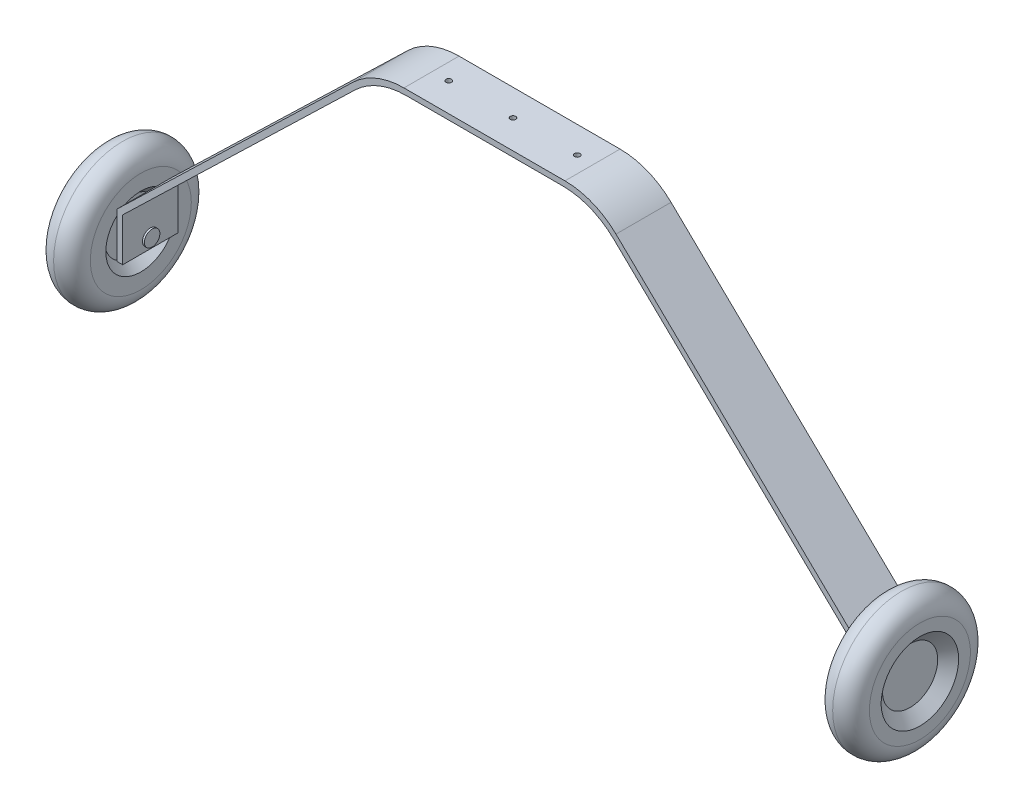
ISO-10303-21;
HEADER;
FILE_DESCRIPTION(('STEP AP214'),'2;1');
FILE_NAME('part.step','',(''),(''),'','','');
FILE_SCHEMA(('AUTOMOTIVE_DESIGN { 1 0 10303 214 1 1 1 1 }'));
ENDSEC;
DATA;
#1=APPLICATION_CONTEXT('core data for automotive mechanical design processes');
#2=APPLICATION_PROTOCOL_DEFINITION('international standard','automotive_design',2000,#1);
#3=PRODUCT_CONTEXT('',#1,'mechanical');
#4=PRODUCT('Part','Part','',(#3));
#5=PRODUCT_RELATED_PRODUCT_CATEGORY('part','',(#4));
#6=PRODUCT_DEFINITION_FORMATION('','',#4);
#7=PRODUCT_DEFINITION_CONTEXT('part definition',#1,'design');
#8=PRODUCT_DEFINITION('design','',#6,#7);
#9=PRODUCT_DEFINITION_SHAPE('','',#8);
#10=(LENGTH_UNIT() NAMED_UNIT(*) SI_UNIT(.MILLI.,.METRE.));
#11=(NAMED_UNIT(*) PLANE_ANGLE_UNIT() SI_UNIT($,.RADIAN.));
#12=(NAMED_UNIT(*) SI_UNIT($,.STERADIAN.) SOLID_ANGLE_UNIT());
#13=UNCERTAINTY_MEASURE_WITH_UNIT(LENGTH_MEASURE(1.E-05),#10,'distance_accuracy_value','');
#14=(GEOMETRIC_REPRESENTATION_CONTEXT(3) GLOBAL_UNCERTAINTY_ASSIGNED_CONTEXT((#13)) GLOBAL_UNIT_ASSIGNED_CONTEXT((#10,
#11,#12)) REPRESENTATION_CONTEXT('',''));
#15=CARTESIAN_POINT('',(0.,0.,0.));
#16=DIRECTION('',(0.,0.,1.));
#17=DIRECTION('',(1.,0.,0.));
#18=AXIS2_PLACEMENT_3D('',#15,#16,#17);
#19=CARTESIAN_POINT('',(-195.998617986797,-224.387010818881,-45.));
#20=DIRECTION('',(-1.,0.,0.));
#21=DIRECTION('',(0.,0.,-1.));
#22=AXIS2_PLACEMENT_3D('',#19,#20,#21);
#23=PLANE('',#22);
#24=CARTESIAN_POINT('',(-195.998617986797,-224.387010818881,-45.));
#25=DIRECTION('',(1.,0.,0.));
#26=DIRECTION('',(0.,0.,-1.));
#27=AXIS2_PLACEMENT_3D('',#24,#25,#26);
#28=CIRCLE('',#27,4.24096034081595);
#29=CARTESIAN_POINT('',(-195.998617986797,-224.387010818881,-49.2409603408159));
#30=VERTEX_POINT('',#29);
#31=EDGE_CURVE('E73',#30,#30,#28,.T.);
#32=ORIENTED_EDGE('',*,*,#31,.T.);
#33=EDGE_LOOP('',(#32));
#34=FACE_BOUND('',#33,.T.);
#35=ADVANCED_FACE('F59',(#34),#23,.F.);
#36=CARTESIAN_POINT('',(-215.998617986797,-224.387010818881,-45.));
#37=DIRECTION('',(-1.,0.,0.));
#38=DIRECTION('',(0.,0.,-1.));
#39=AXIS2_PLACEMENT_3D('',#36,#37,#38);
#40=CYLINDRICAL_SURFACE('',#39,4.24096034081595);
#41=CARTESIAN_POINT('',(-207.268142907966,-224.387010818881,-45.));
#42=DIRECTION('',(1.,0.,0.));
#43=DIRECTION('',(0.,0.,-1.));
#44=AXIS2_PLACEMENT_3D('',#41,#42,#43);
#45=CIRCLE('',#44,4.24096034081595);
#46=CARTESIAN_POINT('',(-207.268142907966,-224.387010818881,-49.2409603408159));
#47=VERTEX_POINT('',#46);
#48=EDGE_CURVE('E79',#47,#47,#45,.T.);
#49=ORIENTED_EDGE('',*,*,#48,.T.);
#50=EDGE_LOOP('',(#49));
#51=FACE_BOUND('',#50,.T.);
#52=ORIENTED_EDGE('',*,*,#31,.F.);
#53=EDGE_LOOP('',(#52));
#54=FACE_BOUND('',#53,.T.);
#55=ADVANCED_FACE('F122',(#51,#54),#40,.T.);
#56=CARTESIAN_POINT('',(-207.268142907966,-220.146050478065,-45.));
#57=DIRECTION('',(-1.,0.,0.));
#58=DIRECTION('',(0.,0.,-1.));
#59=AXIS2_PLACEMENT_3D('',#56,#57,#58);
#60=PLANE('',#59);
#61=CARTESIAN_POINT('',(-207.268142907966,-224.387010818881,-45.));
#62=DIRECTION('',(1.,0.,0.));
#63=DIRECTION('',(0.,0.,-1.));
#64=AXIS2_PLACEMENT_3D('',#61,#62,#63);
#65=CIRCLE('',#64,14.5422249917012);
#66=CARTESIAN_POINT('',(-207.268142907966,-224.387010818881,-59.5422249917012));
#67=VERTEX_POINT('',#66);
#68=EDGE_CURVE('E83',#67,#67,#65,.T.);
#69=ORIENTED_EDGE('',*,*,#68,.T.);
#70=EDGE_LOOP('',(#69));
#71=FACE_BOUND('',#70,.T.);
#72=ORIENTED_EDGE('',*,*,#48,.F.);
#73=EDGE_LOOP('',(#72));
#74=FACE_BOUND('',#73,.T.);
#75=ADVANCED_FACE('F127',(#71,#74),#60,.F.);
#76=CARTESIAN_POINT('',(-207.268142907966,-224.387010818881,-45.));
#77=DIRECTION('',(1.,0.,0.));
#78=DIRECTION('',(0.,0.,1.));
#79=AXIS2_PLACEMENT_3D('',#76,#77,#78);
#80=CONICAL_SURFACE('',#79,14.5422249917012,0.723851281054418);
#81=CARTESIAN_POINT('',(-202.142042365197,-224.387010818881,-45.));
#82=DIRECTION('',(1.,0.,0.));
#83=DIRECTION('',(0.,0.,-1.));
#84=AXIS2_PLACEMENT_3D('',#81,#82,#83);
#85=CIRCLE('',#84,19.0732103774336);
#86=CARTESIAN_POINT('',(-202.142042365197,-224.387010818881,-64.0732103774336));
#87=VERTEX_POINT('',#86);
#88=EDGE_CURVE('E87',#87,#87,#85,.T.);
#89=ORIENTED_EDGE('',*,*,#88,.T.);
#90=EDGE_LOOP('',(#89));
#91=FACE_BOUND('',#90,.T.);
#92=ORIENTED_EDGE('',*,*,#68,.F.);
#93=EDGE_LOOP('',(#92));
#94=FACE_BOUND('',#93,.T.);
#95=ADVANCED_FACE('F133',(#91,#94),#80,.F.);
#96=CARTESIAN_POINT('',(-202.142042365197,-205.313800441447,-45.));
#97=DIRECTION('',(-1.,0.,0.));
#98=DIRECTION('',(0.,0.,-1.));
#99=AXIS2_PLACEMENT_3D('',#96,#97,#98);
#100=PLANE('',#99);
#101=CARTESIAN_POINT('',(-202.142042365197,-224.387010818881,-45.));
#102=DIRECTION('',(1.,0.,0.));
#103=DIRECTION('',(0.,0.,-1.));
#104=AXIS2_PLACEMENT_3D('',#101,#102,#103);
#105=CIRCLE('',#104,27.5);
#106=CARTESIAN_POINT('',(-202.142042365197,-224.387010818881,-72.5));
#107=VERTEX_POINT('',#106);
#108=EDGE_CURVE('E68',#107,#107,#105,.F.);
#109=ORIENTED_EDGE('',*,*,#108,.F.);
#110=EDGE_LOOP('',(#109));
#111=FACE_BOUND('',#110,.T.);
#112=ORIENTED_EDGE('',*,*,#88,.F.);
#113=EDGE_LOOP('',(#112));
#114=FACE_BOUND('',#113,.T.);
#115=ADVANCED_FACE('F137',(#111,#114),#100,.F.);
#116=CARTESIAN_POINT('',(-222.142042365197,-186.887010818881,-45.));
#117=DIRECTION('',(1.,0.,0.));
#118=DIRECTION('',(0.,0.,1.));
#119=AXIS2_PLACEMENT_3D('',#116,#117,#118);
#120=PLANE('',#119);
#121=CARTESIAN_POINT('',(-222.142042365197,-224.387010818881,-45.));
#122=DIRECTION('',(-1.,0.,0.));
#123=DIRECTION('',(0.,0.,1.));
#124=AXIS2_PLACEMENT_3D('',#121,#122,#123);
#125=CIRCLE('',#124,27.5);
#126=CARTESIAN_POINT('',(-222.142042365197,-224.387010818881,-17.5));
#127=VERTEX_POINT('',#126);
#128=EDGE_CURVE('E11',#127,#127,#125,.F.);
#129=ORIENTED_EDGE('',*,*,#128,.F.);
#130=EDGE_LOOP('',(#129));
#131=FACE_BOUND('',#130,.T.);
#132=CARTESIAN_POINT('',(-222.142042365197,-224.387010818881,-45.));
#133=DIRECTION('',(1.,0.,0.));
#134=DIRECTION('',(0.,0.,-1.));
#135=AXIS2_PLACEMENT_3D('',#132,#133,#134);
#136=CIRCLE('',#135,21.0934892980855);
#137=CARTESIAN_POINT('',(-222.142042365197,-224.387010818881,-66.0934892980855));
#138=VERTEX_POINT('',#137);
#139=EDGE_CURVE('E91',#138,#138,#136,.T.);
#140=ORIENTED_EDGE('',*,*,#139,.T.);
#141=EDGE_LOOP('',(#140));
#142=FACE_BOUND('',#141,.T.);
#143=ADVANCED_FACE('F141',(#131,#142),#120,.F.);
#144=CARTESIAN_POINT('',(-222.142042365197,-224.387010818881,-45.));
#145=DIRECTION('',(-1.,0.,0.));
#146=DIRECTION('',(0.,0.,-1.));
#147=AXIS2_PLACEMENT_3D('',#144,#145,#146);
#148=CONICAL_SURFACE('',#147,21.0934892980855,0.846945045740481);
#149=CARTESIAN_POINT('',(-216.793300195848,-224.387010818881,-45.));
#150=DIRECTION('',(1.,0.,0.));
#151=DIRECTION('',(0.,0.,-1.));
#152=AXIS2_PLACEMENT_3D('',#149,#150,#151);
#153=CIRCLE('',#152,15.0422249917012);
#154=CARTESIAN_POINT('',(-216.793300195848,-224.387010818881,-60.0422249917012));
#155=VERTEX_POINT('',#154);
#156=EDGE_CURVE('E95',#155,#155,#153,.T.);
#157=ORIENTED_EDGE('',*,*,#156,.T.);
#158=EDGE_LOOP('',(#157));
#159=FACE_BOUND('',#158,.T.);
#160=ORIENTED_EDGE('',*,*,#139,.F.);
#161=EDGE_LOOP('',(#160));
#162=FACE_BOUND('',#161,.T.);
#163=ADVANCED_FACE('F145',(#159,#162),#148,.F.);
#164=CARTESIAN_POINT('',(-216.793300195848,-209.34478582718,-45.));
#165=DIRECTION('',(1.,0.,0.));
#166=DIRECTION('',(0.,0.,1.));
#167=AXIS2_PLACEMENT_3D('',#164,#165,#166);
#168=PLANE('',#167);
#169=CARTESIAN_POINT('',(-216.793300195848,-224.387010818881,-45.));
#170=DIRECTION('',(1.,0.,0.));
#171=DIRECTION('',(0.,0.,-1.));
#172=AXIS2_PLACEMENT_3D('',#169,#170,#171);
#173=CIRCLE('',#172,0.0284599125627838);
#174=CARTESIAN_POINT('',(-216.793300195848,-224.387010818881,-45.0284599125628));
#175=VERTEX_POINT('',#174);
#176=EDGE_CURVE('E99',#175,#175,#173,.T.);
#177=ORIENTED_EDGE('',*,*,#176,.T.);
#178=EDGE_LOOP('',(#177));
#179=FACE_BOUND('',#178,.T.);
#180=ORIENTED_EDGE('',*,*,#156,.F.);
#181=EDGE_LOOP('',(#180));
#182=FACE_BOUND('',#181,.T.);
#183=ADVANCED_FACE('F149',(#179,#182),#168,.F.);
#184=CARTESIAN_POINT('',(-215.998617986797,-224.387010818881,-45.));
#185=DIRECTION('',(-1.,0.,0.));
#186=DIRECTION('',(0.,0.,-1.));
#187=AXIS2_PLACEMENT_3D('',#184,#185,#186);
#188=CYLINDRICAL_SURFACE('',#187,0.0284599125627838);
#189=CARTESIAN_POINT('',(-215.998617986797,-224.387010818881,-45.));
#190=DIRECTION('',(1.,0.,0.));
#191=DIRECTION('',(0.,0.,-1.));
#192=AXIS2_PLACEMENT_3D('',#189,#190,#191);
#193=CIRCLE('',#192,0.0284599125627838);
#194=CARTESIAN_POINT('',(-215.998617986797,-224.387010818881,-45.0284599125628));
#195=VERTEX_POINT('',#194);
#196=EDGE_CURVE('E103',#195,#195,#193,.T.);
#197=ORIENTED_EDGE('',*,*,#196,.T.);
#198=EDGE_LOOP('',(#197));
#199=FACE_BOUND('',#198,.T.);
#200=ORIENTED_EDGE('',*,*,#176,.F.);
#201=EDGE_LOOP('',(#200));
#202=FACE_BOUND('',#201,.T.);
#203=ADVANCED_FACE('F153',(#199,#202),#188,.F.);
#204=CARTESIAN_POINT('',(-215.998617986797,-224.358550906318,-45.));
#205=DIRECTION('',(1.,0.,0.));
#206=DIRECTION('',(0.,0.,1.));
#207=AXIS2_PLACEMENT_3D('',#204,#205,#206);
#208=PLANE('',#207);
#209=ORIENTED_EDGE('',*,*,#196,.F.);
#210=EDGE_LOOP('',(#209));
#211=FACE_BOUND('',#210,.T.);
#212=ADVANCED_FACE('F119',(#211),#208,.F.);
#213=CARTESIAN_POINT('',(-212.142042365197,-224.387010818881,-45.));
#214=DIRECTION('',(1.,0.,0.));
#215=DIRECTION('',(0.,0.,1.));
#216=AXIS2_PLACEMENT_3D('',#213,#214,#215);
#217=TOROIDAL_SURFACE('',#216,27.5,10.);
#218=ORIENTED_EDGE('',*,*,#128,.T.);
#219=EDGE_LOOP('',(#218));
#220=FACE_BOUND('',#219,.T.);
#221=CARTESIAN_POINT('',(-212.142042365197,-224.387010818881,-45.));
#222=DIRECTION('',(-1.,0.,0.));
#223=DIRECTION('',(0.,0.,1.));
#224=AXIS2_PLACEMENT_3D('',#221,#222,#223);
#225=CIRCLE('',#224,37.5);
#226=CARTESIAN_POINT('',(-212.142042365197,-224.387010818881,-7.49999999999999));
#227=VERTEX_POINT('',#226);
#228=EDGE_CURVE('E63',#227,#227,#225,.T.);
#229=ORIENTED_EDGE('',*,*,#228,.T.);
#230=EDGE_LOOP('',(#229));
#231=FACE_BOUND('',#230,.T.);
#232=ADVANCED_FACE('F61',(#220,#231),#217,.T.);
#233=CARTESIAN_POINT('',(-212.142042365197,-224.387010818881,-45.));
#234=DIRECTION('',(-1.,0.,0.));
#235=DIRECTION('',(0.,0.,-1.));
#236=AXIS2_PLACEMENT_3D('',#233,#234,#235);
#237=TOROIDAL_SURFACE('',#236,27.5,10.);
#238=ORIENTED_EDGE('',*,*,#108,.T.);
#239=EDGE_LOOP('',(#238));
#240=FACE_BOUND('',#239,.T.);
#241=ORIENTED_EDGE('',*,*,#228,.F.);
#242=EDGE_LOOP('',(#241));
#243=FACE_BOUND('',#242,.T.);
#244=ADVANCED_FACE('F113',(#240,#243),#237,.T.);
#245=CLOSED_SHELL('',(#35,#55,#75,#95,#115,#143,#163,#183,#203,#212,#232,#244));
#246=MANIFOLD_SOLID_BREP('B2',#245);
#247=CARTESIAN_POINT('',(195.998617986797,-224.387010818881,-45.));
#248=DIRECTION('',(1.,0.,0.));
#249=DIRECTION('',(0.,0.,-1.));
#250=AXIS2_PLACEMENT_3D('',#247,#248,#249);
#251=PLANE('',#250);
#252=CARTESIAN_POINT('',(195.998617986797,-224.387010818881,-45.));
#253=DIRECTION('',(1.,0.,0.));
#254=DIRECTION('',(0.,0.,-1.));
#255=AXIS2_PLACEMENT_3D('',#252,#253,#254);
#256=CIRCLE('',#255,4.24096034081595);
#257=CARTESIAN_POINT('',(195.998617986797,-224.387010818881,-49.2409603408159));
#258=VERTEX_POINT('',#257);
#259=EDGE_CURVE('E358',#258,#258,#256,.T.);
#260=ORIENTED_EDGE('',*,*,#259,.F.);
#261=EDGE_LOOP('',(#260));
#262=FACE_BOUND('',#261,.T.);
#263=ADVANCED_FACE('F346',(#262),#251,.F.);
#264=CARTESIAN_POINT('',(215.998617986797,-224.387010818881,-45.));
#265=DIRECTION('',(1.,0.,0.));
#266=DIRECTION('',(0.,0.,-1.));
#267=AXIS2_PLACEMENT_3D('',#264,#265,#266);
#268=CYLINDRICAL_SURFACE('',#267,4.24096034081595);
#269=CARTESIAN_POINT('',(207.268142907966,-224.387010818881,-45.));
#270=DIRECTION('',(1.,0.,0.));
#271=DIRECTION('',(0.,0.,-1.));
#272=AXIS2_PLACEMENT_3D('',#269,#270,#271);
#273=CIRCLE('',#272,4.24096034081595);
#274=CARTESIAN_POINT('',(207.268142907966,-224.387010818881,-49.2409603408159));
#275=VERTEX_POINT('',#274);
#276=EDGE_CURVE('E363',#275,#275,#273,.T.);
#277=ORIENTED_EDGE('',*,*,#276,.F.);
#278=EDGE_LOOP('',(#277));
#279=FACE_BOUND('',#278,.T.);
#280=ORIENTED_EDGE('',*,*,#259,.T.);
#281=EDGE_LOOP('',(#280));
#282=FACE_BOUND('',#281,.T.);
#283=ADVANCED_FACE('F402',(#279,#282),#268,.T.);
#284=CARTESIAN_POINT('',(207.268142907966,-220.146050478065,-45.));
#285=DIRECTION('',(1.,0.,0.));
#286=DIRECTION('',(0.,0.,-1.));
#287=AXIS2_PLACEMENT_3D('',#284,#285,#286);
#288=PLANE('',#287);
#289=CARTESIAN_POINT('',(207.268142907966,-224.387010818881,-45.));
#290=DIRECTION('',(1.,0.,0.));
#291=DIRECTION('',(0.,0.,-1.));
#292=AXIS2_PLACEMENT_3D('',#289,#290,#291);
#293=CIRCLE('',#292,14.5422249917012);
#294=CARTESIAN_POINT('',(207.268142907966,-224.387010818881,-59.5422249917012));
#295=VERTEX_POINT('',#294);
#296=EDGE_CURVE('E366',#295,#295,#293,.T.);
#297=ORIENTED_EDGE('',*,*,#296,.F.);
#298=EDGE_LOOP('',(#297));
#299=FACE_BOUND('',#298,.T.);
#300=ORIENTED_EDGE('',*,*,#276,.T.);
#301=EDGE_LOOP('',(#300));
#302=FACE_BOUND('',#301,.T.);
#303=ADVANCED_FACE('F408',(#299,#302),#288,.F.);
#304=CARTESIAN_POINT('',(207.268142907966,-224.387010818881,-45.));
#305=DIRECTION('',(-1.,0.,0.));
#306=DIRECTION('',(0.,0.,1.));
#307=AXIS2_PLACEMENT_3D('',#304,#305,#306);
#308=CONICAL_SURFACE('',#307,14.5422249917012,0.723851281054418);
#309=CARTESIAN_POINT('',(202.142042365197,-224.387010818881,-45.));
#310=DIRECTION('',(1.,0.,0.));
#311=DIRECTION('',(0.,0.,-1.));
#312=AXIS2_PLACEMENT_3D('',#309,#310,#311);
#313=CIRCLE('',#312,19.0732103774336);
#314=CARTESIAN_POINT('',(202.142042365197,-224.387010818881,-64.0732103774336));
#315=VERTEX_POINT('',#314);
#316=EDGE_CURVE('E369',#315,#315,#313,.T.);
#317=ORIENTED_EDGE('',*,*,#316,.F.);
#318=EDGE_LOOP('',(#317));
#319=FACE_BOUND('',#318,.T.);
#320=ORIENTED_EDGE('',*,*,#296,.T.);
#321=EDGE_LOOP('',(#320));
#322=FACE_BOUND('',#321,.T.);
#323=ADVANCED_FACE('F415',(#319,#322),#308,.F.);
#324=CARTESIAN_POINT('',(202.142042365197,-205.313800441447,-45.));
#325=DIRECTION('',(1.,0.,0.));
#326=DIRECTION('',(0.,0.,-1.));
#327=AXIS2_PLACEMENT_3D('',#324,#325,#326);
#328=PLANE('',#327);
#329=CARTESIAN_POINT('',(202.142042365197,-224.387010818881,-45.));
#330=DIRECTION('',(1.,0.,0.));
#331=DIRECTION('',(0.,0.,-1.));
#332=AXIS2_PLACEMENT_3D('',#329,#330,#331);
#333=CIRCLE('',#332,27.5);
#334=CARTESIAN_POINT('',(202.142042365197,-224.387010818881,-72.5));
#335=VERTEX_POINT('',#334);
#336=EDGE_CURVE('E354',#335,#335,#333,.F.);
#337=ORIENTED_EDGE('',*,*,#336,.T.);
#338=EDGE_LOOP('',(#337));
#339=FACE_BOUND('',#338,.T.);
#340=ORIENTED_EDGE('',*,*,#316,.T.);
#341=EDGE_LOOP('',(#340));
#342=FACE_BOUND('',#341,.T.);
#343=ADVANCED_FACE('F419',(#339,#342),#328,.F.);
#344=CARTESIAN_POINT('',(222.142042365197,-186.887010818881,-45.));
#345=DIRECTION('',(-1.,0.,0.));
#346=DIRECTION('',(0.,0.,1.));
#347=AXIS2_PLACEMENT_3D('',#344,#345,#346);
#348=PLANE('',#347);
#349=CARTESIAN_POINT('',(222.142042365197,-224.387010818881,-45.));
#350=DIRECTION('',(-1.,0.,0.));
#351=DIRECTION('',(0.,0.,1.));
#352=AXIS2_PLACEMENT_3D('',#349,#350,#351);
#353=CIRCLE('',#352,27.5);
#354=CARTESIAN_POINT('',(222.142042365197,-224.387010818881,-17.5));
#355=VERTEX_POINT('',#354);
#356=EDGE_CURVE('E58',#355,#355,#353,.F.);
#357=ORIENTED_EDGE('',*,*,#356,.T.);
#358=EDGE_LOOP('',(#357));
#359=FACE_BOUND('',#358,.T.);
#360=CARTESIAN_POINT('',(222.142042365197,-224.387010818881,-45.));
#361=DIRECTION('',(1.,0.,0.));
#362=DIRECTION('',(0.,0.,-1.));
#363=AXIS2_PLACEMENT_3D('',#360,#361,#362);
#364=CIRCLE('',#363,21.0934892980855);
#365=CARTESIAN_POINT('',(222.142042365197,-224.387010818881,-66.0934892980855));
#366=VERTEX_POINT('',#365);
#367=EDGE_CURVE('E372',#366,#366,#364,.T.);
#368=ORIENTED_EDGE('',*,*,#367,.F.);
#369=EDGE_LOOP('',(#368));
#370=FACE_BOUND('',#369,.T.);
#371=ADVANCED_FACE('F423',(#359,#370),#348,.F.);
#372=CARTESIAN_POINT('',(222.142042365197,-224.387010818881,-45.));
#373=DIRECTION('',(1.,0.,0.));
#374=DIRECTION('',(0.,0.,-1.));
#375=AXIS2_PLACEMENT_3D('',#372,#373,#374);
#376=CONICAL_SURFACE('',#375,21.0934892980855,0.846945045740481);
#377=CARTESIAN_POINT('',(216.793300195848,-224.387010818881,-45.));
#378=DIRECTION('',(1.,0.,0.));
#379=DIRECTION('',(0.,0.,-1.));
#380=AXIS2_PLACEMENT_3D('',#377,#378,#379);
#381=CIRCLE('',#380,15.0422249917012);
#382=CARTESIAN_POINT('',(216.793300195848,-224.387010818881,-60.0422249917012));
#383=VERTEX_POINT('',#382);
#384=EDGE_CURVE('E375',#383,#383,#381,.T.);
#385=ORIENTED_EDGE('',*,*,#384,.F.);
#386=EDGE_LOOP('',(#385));
#387=FACE_BOUND('',#386,.T.);
#388=ORIENTED_EDGE('',*,*,#367,.T.);
#389=EDGE_LOOP('',(#388));
#390=FACE_BOUND('',#389,.T.);
#391=ADVANCED_FACE('F426',(#387,#390),#376,.F.);
#392=CARTESIAN_POINT('',(216.793300195848,-209.34478582718,-45.));
#393=DIRECTION('',(-1.,0.,0.));
#394=DIRECTION('',(0.,0.,1.));
#395=AXIS2_PLACEMENT_3D('',#392,#393,#394);
#396=PLANE('',#395);
#397=CARTESIAN_POINT('',(216.793300195848,-224.387010818881,-45.));
#398=DIRECTION('',(1.,0.,0.));
#399=DIRECTION('',(0.,0.,-1.));
#400=AXIS2_PLACEMENT_3D('',#397,#398,#399);
#401=CIRCLE('',#400,0.0284599125627838);
#402=CARTESIAN_POINT('',(216.793300195848,-224.387010818881,-45.0284599125628));
#403=VERTEX_POINT('',#402);
#404=EDGE_CURVE('E378',#403,#403,#401,.T.);
#405=ORIENTED_EDGE('',*,*,#404,.F.);
#406=EDGE_LOOP('',(#405));
#407=FACE_BOUND('',#406,.T.);
#408=ORIENTED_EDGE('',*,*,#384,.T.);
#409=EDGE_LOOP('',(#408));
#410=FACE_BOUND('',#409,.T.);
#411=ADVANCED_FACE('F429',(#407,#410),#396,.F.);
#412=CARTESIAN_POINT('',(215.998617986797,-224.387010818881,-45.));
#413=DIRECTION('',(1.,0.,0.));
#414=DIRECTION('',(0.,0.,-1.));
#415=AXIS2_PLACEMENT_3D('',#412,#413,#414);
#416=CYLINDRICAL_SURFACE('',#415,0.0284599125627838);
#417=CARTESIAN_POINT('',(215.998617986797,-224.387010818881,-45.));
#418=DIRECTION('',(1.,0.,0.));
#419=DIRECTION('',(0.,0.,-1.));
#420=AXIS2_PLACEMENT_3D('',#417,#418,#419);
#421=CIRCLE('',#420,0.0284599125627838);
#422=CARTESIAN_POINT('',(215.998617986797,-224.387010818881,-45.0284599125628));
#423=VERTEX_POINT('',#422);
#424=EDGE_CURVE('E381',#423,#423,#421,.T.);
#425=ORIENTED_EDGE('',*,*,#424,.F.);
#426=EDGE_LOOP('',(#425));
#427=FACE_BOUND('',#426,.T.);
#428=ORIENTED_EDGE('',*,*,#404,.T.);
#429=EDGE_LOOP('',(#428));
#430=FACE_BOUND('',#429,.T.);
#431=ADVANCED_FACE('F399',(#427,#430),#416,.F.);
#432=CARTESIAN_POINT('',(215.998617986797,-224.358550906318,-45.));
#433=DIRECTION('',(-1.,0.,0.));
#434=DIRECTION('',(0.,0.,1.));
#435=AXIS2_PLACEMENT_3D('',#432,#433,#434);
#436=PLANE('',#435);
#437=ORIENTED_EDGE('',*,*,#424,.T.);
#438=EDGE_LOOP('',(#437));
#439=FACE_BOUND('',#438,.T.);
#440=ADVANCED_FACE('F391',(#439),#436,.F.);
#441=CARTESIAN_POINT('',(212.142042365197,-224.387010818881,-45.));
#442=DIRECTION('',(-1.,0.,0.));
#443=DIRECTION('',(0.,0.,1.));
#444=AXIS2_PLACEMENT_3D('',#441,#442,#443);
#445=TOROIDAL_SURFACE('',#444,27.5,10.);
#446=ORIENTED_EDGE('',*,*,#356,.F.);
#447=EDGE_LOOP('',(#446));
#448=FACE_BOUND('',#447,.T.);
#449=CARTESIAN_POINT('',(212.142042365197,-224.387010818881,-45.));
#450=DIRECTION('',(-1.,0.,0.));
#451=DIRECTION('',(0.,0.,1.));
#452=AXIS2_PLACEMENT_3D('',#449,#450,#451);
#453=CIRCLE('',#452,37.5);
#454=CARTESIAN_POINT('',(212.142042365197,-224.387010818881,-7.49999999999999));
#455=VERTEX_POINT('',#454);
#456=EDGE_CURVE('E350',#455,#455,#453,.T.);
#457=ORIENTED_EDGE('',*,*,#456,.F.);
#458=EDGE_LOOP('',(#457));
#459=FACE_BOUND('',#458,.T.);
#460=ADVANCED_FACE('F348',(#448,#459),#445,.T.);
#461=CARTESIAN_POINT('',(212.142042365197,-224.387010818881,-45.));
#462=DIRECTION('',(1.,0.,0.));
#463=DIRECTION('',(0.,0.,-1.));
#464=AXIS2_PLACEMENT_3D('',#461,#462,#463);
#465=TOROIDAL_SURFACE('',#464,27.5,10.);
#466=ORIENTED_EDGE('',*,*,#336,.F.);
#467=EDGE_LOOP('',(#466));
#468=FACE_BOUND('',#467,.T.);
#469=ORIENTED_EDGE('',*,*,#456,.T.);
#470=EDGE_LOOP('',(#469));
#471=FACE_BOUND('',#470,.T.);
#472=ADVANCED_FACE('F388',(#468,#471),#465,.T.);
#473=CLOSED_SHELL('',(#263,#283,#303,#323,#343,#371,#391,#411,#431,#440,#460,#472));
#474=MANIFOLD_SOLID_BREP('B6',#473);
#475=CARTESIAN_POINT('',(0.,-70.,-30.));
#476=DIRECTION('',(0.,1.,0.));
#477=DIRECTION('',(-1.,0.,0.));
#478=AXIS2_PLACEMENT_3D('',#475,#476,#477);
#479=PLANE('',#478);
#480=CARTESIAN_POINT('',(35.,-70.,-45.5448412885914));
#481=DIRECTION('',(0.,1.,0.));
#482=DIRECTION('',(-1.,0.,0.));
#483=AXIS2_PLACEMENT_3D('',#480,#481,#482);
#484=CIRCLE('',#483,1.5);
#485=CARTESIAN_POINT('',(33.5,-70.,-45.5448412885914));
#486=VERTEX_POINT('',#485);
#487=EDGE_CURVE('E733',#486,#486,#484,.T.);
#488=ORIENTED_EDGE('',*,*,#487,.F.);
#489=EDGE_LOOP('',(#488));
#490=FACE_BOUND('',#489,.T.);
#491=CARTESIAN_POINT('',(-35.,-70.,-45.5448412885914));
#492=DIRECTION('',(0.,1.,0.));
#493=DIRECTION('',(-1.,0.,0.));
#494=AXIS2_PLACEMENT_3D('',#491,#492,#493);
#495=CIRCLE('',#494,1.5);
#496=CARTESIAN_POINT('',(-36.5,-70.,-45.5448412885914));
#497=VERTEX_POINT('',#496);
#498=EDGE_CURVE('E853',#497,#497,#495,.T.);
#499=ORIENTED_EDGE('',*,*,#498,.F.);
#500=EDGE_LOOP('',(#499));
#501=FACE_BOUND('',#500,.T.);
#502=CARTESIAN_POINT('',(0.,-70.,-45.5448412885914));
#503=DIRECTION('',(0.,1.,0.));
#504=DIRECTION('',(-1.,0.,0.));
#505=AXIS2_PLACEMENT_3D('',#502,#503,#504);
#506=CIRCLE('',#505,1.5);
#507=CARTESIAN_POINT('',(-1.49999999999992,-70.,-45.5448412885914));
#508=VERTEX_POINT('',#507);
#509=EDGE_CURVE('E856',#508,#508,#506,.T.);
#510=ORIENTED_EDGE('',*,*,#509,.F.);
#511=EDGE_LOOP('',(#510));
#512=FACE_BOUND('',#511,.T.);
#513=DIRECTION('',(1.,0.,0.));
#514=VECTOR('',#513,1.);
#515=CARTESIAN_POINT('',(0.,-70.,-60.));
#516=LINE('',#515,#514);
#517=CARTESIAN_POINT('',(-43.841114339405,-70.,-60.));
#518=VERTEX_POINT('',#517);
#519=CARTESIAN_POINT('',(43.8411143394051,-70.,-60.));
#520=VERTEX_POINT('',#519);
#521=EDGE_CURVE('E730',#518,#520,#516,.T.);
#522=ORIENTED_EDGE('',*,*,#521,.F.);
#523=DIRECTION('',(0.,0.,-1.));
#524=VECTOR('',#523,1.);
#525=CARTESIAN_POINT('',(-43.841114339405,-70.,-30.));
#526=LINE('',#525,#524);
#527=CARTESIAN_POINT('',(-43.841114339405,-70.,-30.));
#528=VERTEX_POINT('',#527);
#529=EDGE_CURVE('E784',#518,#528,#526,.F.);
#530=ORIENTED_EDGE('',*,*,#529,.T.);
#531=DIRECTION('',(1.,0.,0.));
#532=VECTOR('',#531,1.);
#533=CARTESIAN_POINT('',(0.,-70.,-30.));
#534=LINE('',#533,#532);
#535=CARTESIAN_POINT('',(43.8411143394051,-70.,-30.));
#536=VERTEX_POINT('',#535);
#537=EDGE_CURVE('E690',#528,#536,#534,.T.);
#538=ORIENTED_EDGE('',*,*,#537,.T.);
#539=DIRECTION('',(0.,0.,-1.));
#540=VECTOR('',#539,1.);
#541=CARTESIAN_POINT('',(43.8411143394051,-70.,-30.));
#542=LINE('',#541,#540);
#543=EDGE_CURVE('E781',#536,#520,#542,.T.);
#544=ORIENTED_EDGE('',*,*,#543,.T.);
#545=EDGE_LOOP('',(#522,#530,#538,#544));
#546=FACE_BOUND('',#545,.T.);
#547=ADVANCED_FACE('F565',(#490,#501,#512,#546),#479,.T.);
#548=CARTESIAN_POINT('',(6.03101211516341,-6.2464582015198,-30.));
#549=DIRECTION('',(0.69459147527702,-0.719404394254367,0.));
#550=DIRECTION('',(0.719404394254367,0.69459147527702,0.));
#551=AXIS2_PLACEMENT_3D('',#548,#549,#550);
#552=PLANE('',#551);
#553=DIRECTION('',(-0.719404394254367,-0.69459147527702,0.));
#554=VECTOR('',#553,1.);
#555=CARTESIAN_POINT('',(6.03101211516341,-6.2464582015198,-30.));
#556=LINE('',#555,#554);
#557=CARTESIAN_POINT('',(-71.6247733504858,-81.2238242298254,-30.));
#558=VERTEX_POINT('',#557);
#559=CARTESIAN_POINT('',(-200.,-205.171271284173,-30.));
#560=VERTEX_POINT('',#559);
#561=EDGE_CURVE('E677',#558,#560,#556,.T.);
#562=ORIENTED_EDGE('',*,*,#561,.F.);
#563=DIRECTION('',(0.,0.,-1.));
#564=VECTOR('',#563,1.);
#565=CARTESIAN_POINT('',(-71.6247733504858,-81.2238242298253,-60.));
#566=LINE('',#565,#564);
#567=CARTESIAN_POINT('',(-71.6247733504858,-81.2238242298254,-60.));
#568=VERTEX_POINT('',#567);
#569=EDGE_CURVE('E700',#558,#568,#566,.T.);
#570=ORIENTED_EDGE('',*,*,#569,.T.);
#571=DIRECTION('',(-0.719404394254367,-0.69459147527702,0.));
#572=VECTOR('',#571,1.);
#573=CARTESIAN_POINT('',(6.03101211516341,-6.2464582015198,-60.));
#574=LINE('',#573,#572);
#575=CARTESIAN_POINT('',(-200.,-205.171271284173,-60.));
#576=VERTEX_POINT('',#575);
#577=EDGE_CURVE('E696',#568,#576,#574,.T.);
#578=ORIENTED_EDGE('',*,*,#577,.T.);
#579=DIRECTION('',(0.,0.,-1.));
#580=VECTOR('',#579,1.);
#581=CARTESIAN_POINT('',(-200.,-205.171271284173,-30.));
#582=LINE('',#581,#580);
#583=EDGE_CURVE('E693',#560,#576,#582,.T.);
#584=ORIENTED_EDGE('',*,*,#583,.F.);
#585=EDGE_LOOP('',(#562,#570,#578,#584));
#586=FACE_BOUND('',#585,.T.);
#587=ADVANCED_FACE('F694',(#586),#552,.F.);
#588=CARTESIAN_POINT('',(-200.,2.23576292876693E-13,-30.));
#589=DIRECTION('',(1.,0.,0.));
#590=DIRECTION('',(0.,1.,0.));
#591=AXIS2_PLACEMENT_3D('',#588,#589,#590);
#592=PLANE('',#591);
#593=DIRECTION('',(0.,-1.,0.));
#594=VECTOR('',#593,1.);
#595=CARTESIAN_POINT('',(-200.,2.23576292876693E-13,-60.));
#596=LINE('',#595,#594);
#597=CARTESIAN_POINT('',(-200.,-230.,-60.));
#598=VERTEX_POINT('',#597);
#599=EDGE_CURVE('E735',#576,#598,#596,.T.);
#600=ORIENTED_EDGE('',*,*,#599,.T.);
#601=DIRECTION('',(0.,0.,-1.));
#602=VECTOR('',#601,1.);
#603=CARTESIAN_POINT('',(-200.,-230.,-30.));
#604=LINE('',#603,#602);
#605=CARTESIAN_POINT('',(-200.,-230.,-30.));
#606=VERTEX_POINT('',#605);
#607=EDGE_CURVE('E701',#606,#598,#604,.T.);
#608=ORIENTED_EDGE('',*,*,#607,.F.);
#609=DIRECTION('',(0.,-1.,0.));
#610=VECTOR('',#609,1.);
#611=CARTESIAN_POINT('',(-200.,2.23576292876693E-13,-30.));
#612=LINE('',#611,#610);
#613=EDGE_CURVE('E683',#560,#606,#612,.T.);
#614=ORIENTED_EDGE('',*,*,#613,.F.);
#615=ORIENTED_EDGE('',*,*,#583,.T.);
#616=EDGE_LOOP('',(#600,#608,#614,#615));
#617=FACE_BOUND('',#616,.T.);
#618=ADVANCED_FACE('F703',(#617),#592,.F.);
#619=CARTESIAN_POINT('',(0.,-230.,-30.));
#620=DIRECTION('',(0.,-1.,0.));
#621=DIRECTION('',(0.,0.,-1.));
#622=AXIS2_PLACEMENT_3D('',#619,#620,#621);
#623=PLANE('',#622);
#624=DIRECTION('',(-1.,0.,0.));
#625=VECTOR('',#624,1.);
#626=CARTESIAN_POINT('',(0.,-230.,-60.));
#627=LINE('',#626,#625);
#628=CARTESIAN_POINT('',(-197.,-230.,-60.));
#629=VERTEX_POINT('',#628);
#630=EDGE_CURVE('E737',#629,#598,#627,.T.);
#631=ORIENTED_EDGE('',*,*,#630,.F.);
#632=DIRECTION('',(0.,0.,-1.));
#633=VECTOR('',#632,1.);
#634=CARTESIAN_POINT('',(-197.,-230.,-30.));
#635=LINE('',#634,#633);
#636=CARTESIAN_POINT('',(-197.,-230.,-30.));
#637=VERTEX_POINT('',#636);
#638=EDGE_CURVE('E773',#637,#629,#635,.T.);
#639=ORIENTED_EDGE('',*,*,#638,.F.);
#640=DIRECTION('',(-1.,0.,0.));
#641=VECTOR('',#640,1.);
#642=CARTESIAN_POINT('',(0.,-230.,-30.));
#643=LINE('',#642,#641);
#644=EDGE_CURVE('E705',#637,#606,#643,.T.);
#645=ORIENTED_EDGE('',*,*,#644,.T.);
#646=ORIENTED_EDGE('',*,*,#607,.T.);
#647=EDGE_LOOP('',(#631,#639,#645,#646));
#648=FACE_BOUND('',#647,.T.);
#649=ADVANCED_FACE('F945',(#648),#623,.T.);
#650=CARTESIAN_POINT('',(-197.,-2.32129738083942E-13,-30.));
#651=DIRECTION('',(1.,0.,0.));
#652=DIRECTION('',(0.,1.,0.));
#653=AXIS2_PLACEMENT_3D('',#650,#651,#652);
#654=PLANE('',#653);
#655=DIRECTION('',(0.,-1.,0.));
#656=VECTOR('',#655,1.);
#657=CARTESIAN_POINT('',(-197.,-2.32129738083942E-13,-60.));
#658=LINE('',#657,#656);
#659=CARTESIAN_POINT('',(-197.,-206.444860355197,-60.));
#660=VERTEX_POINT('',#659);
#661=EDGE_CURVE('E740',#660,#629,#658,.T.);
#662=ORIENTED_EDGE('',*,*,#661,.F.);
#663=DIRECTION('',(0.,0.,-1.));
#664=VECTOR('',#663,1.);
#665=CARTESIAN_POINT('',(-197.,-206.444860355197,-30.));
#666=LINE('',#665,#664);
#667=CARTESIAN_POINT('',(-197.,-206.444860355197,-30.));
#668=VERTEX_POINT('',#667);
#669=EDGE_CURVE('E770',#668,#660,#666,.T.);
#670=ORIENTED_EDGE('',*,*,#669,.F.);
#671=DIRECTION('',(0.,-1.,0.));
#672=VECTOR('',#671,1.);
#673=CARTESIAN_POINT('',(-197.,-2.32129738083942E-13,-30.));
#674=LINE('',#673,#672);
#675=EDGE_CURVE('E707',#668,#637,#674,.T.);
#676=ORIENTED_EDGE('',*,*,#675,.T.);
#677=ORIENTED_EDGE('',*,*,#638,.T.);
#678=EDGE_LOOP('',(#662,#670,#676,#677));
#679=FACE_BOUND('',#678,.T.);
#680=ADVANCED_FACE('F1016',(#679),#654,.T.);
#681=CARTESIAN_POINT('',(8.11478654099446,-8.40467138428288,-30.));
#682=DIRECTION('',(0.69459147527702,-0.719404394254367,0.));
#683=DIRECTION('',(0.719404394254367,0.69459147527702,0.));
#684=AXIS2_PLACEMENT_3D('',#681,#682,#683);
#685=PLANE('',#684);
#686=DIRECTION('',(-0.719404394254367,-0.69459147527702,0.));
#687=VECTOR('',#686,1.);
#688=CARTESIAN_POINT('',(8.11478654099446,-8.40467138428288,-60.));
#689=LINE('',#688,#687);
#690=CARTESIAN_POINT('',(-70.4128569259412,-84.2238242298253,-60.));
#691=VERTEX_POINT('',#690);
#692=EDGE_CURVE('E743',#691,#660,#689,.T.);
#693=ORIENTED_EDGE('',*,*,#692,.F.);
#694=DIRECTION('',(0.,0.,-1.));
#695=VECTOR('',#694,1.);
#696=CARTESIAN_POINT('',(-70.4128569259412,-84.2238242298253,-30.));
#697=LINE('',#696,#695);
#698=CARTESIAN_POINT('',(-70.4128569259412,-84.2238242298253,-30.));
#699=VERTEX_POINT('',#698);
#700=EDGE_CURVE('E798',#691,#699,#697,.F.);
#701=ORIENTED_EDGE('',*,*,#700,.T.);
#702=DIRECTION('',(-0.719404394254367,-0.69459147527702,0.));
#703=VECTOR('',#702,1.);
#704=CARTESIAN_POINT('',(8.11478654099446,-8.40467138428288,-30.));
#705=LINE('',#704,#703);
#706=EDGE_CURVE('E713',#699,#668,#705,.T.);
#707=ORIENTED_EDGE('',*,*,#706,.T.);
#708=ORIENTED_EDGE('',*,*,#669,.T.);
#709=EDGE_LOOP('',(#693,#701,#707,#708));
#710=FACE_BOUND('',#709,.T.);
#711=ADVANCED_FACE('F810',(#710),#685,.T.);
#712=CARTESIAN_POINT('',(0.,-73.,-30.));
#713=DIRECTION('',(0.,-1.,0.));
#714=DIRECTION('',(0.,0.,-1.));
#715=AXIS2_PLACEMENT_3D('',#712,#713,#714);
#716=PLANE('',#715);
#717=CARTESIAN_POINT('',(35.,-73.,-45.5448412885914));
#718=DIRECTION('',(0.,-1.,0.));
#719=DIRECTION('',(0.,0.,-1.));
#720=AXIS2_PLACEMENT_3D('',#717,#718,#719);
#721=CIRCLE('',#720,1.5);
#722=CARTESIAN_POINT('',(35.,-73.,-47.0448412885914));
#723=VERTEX_POINT('',#722);
#724=EDGE_CURVE('E859',#723,#723,#721,.T.);
#725=ORIENTED_EDGE('',*,*,#724,.F.);
#726=EDGE_LOOP('',(#725));
#727=FACE_BOUND('',#726,.T.);
#728=CARTESIAN_POINT('',(-35.,-73.,-45.5448412885914));
#729=DIRECTION('',(0.,-1.,0.));
#730=DIRECTION('',(0.,0.,1.));
#731=AXIS2_PLACEMENT_3D('',#728,#729,#730);
#732=CIRCLE('',#731,1.5);
#733=CARTESIAN_POINT('',(-35.,-73.,-44.0448412885914));
#734=VERTEX_POINT('',#733);
#735=EDGE_CURVE('E863',#734,#734,#732,.T.);
#736=ORIENTED_EDGE('',*,*,#735,.F.);
#737=EDGE_LOOP('',(#736));
#738=FACE_BOUND('',#737,.T.);
#739=CARTESIAN_POINT('',(0.,-73.,-45.5448412885914));
#740=DIRECTION('',(0.,-1.,0.));
#741=DIRECTION('',(0.,0.,-1.));
#742=AXIS2_PLACEMENT_3D('',#739,#740,#741);
#743=CIRCLE('',#742,1.5);
#744=CARTESIAN_POINT('',(0.,-73.,-47.0448412885914));
#745=VERTEX_POINT('',#744);
#746=EDGE_CURVE('E860',#745,#745,#743,.T.);
#747=ORIENTED_EDGE('',*,*,#746,.F.);
#748=EDGE_LOOP('',(#747));
#749=FACE_BOUND('',#748,.T.);
#750=DIRECTION('',(-1.,0.,0.));
#751=VECTOR('',#750,1.);
#752=CARTESIAN_POINT('',(0.,-73.,-60.));
#753=LINE('',#752,#751);
#754=CARTESIAN_POINT('',(42.6291979148605,-73.,-60.));
#755=VERTEX_POINT('',#754);
#756=CARTESIAN_POINT('',(-42.6291979148604,-73.,-60.));
#757=VERTEX_POINT('',#756);
#758=EDGE_CURVE('E745',#755,#757,#753,.T.);
#759=ORIENTED_EDGE('',*,*,#758,.F.);
#760=DIRECTION('',(0.,0.,-1.));
#761=VECTOR('',#760,1.);
#762=CARTESIAN_POINT('',(42.6291979148605,-73.,-30.));
#763=LINE('',#762,#761);
#764=CARTESIAN_POINT('',(42.6291979148605,-73.,-30.));
#765=VERTEX_POINT('',#764);
#766=EDGE_CURVE('E796',#755,#765,#763,.F.);
#767=ORIENTED_EDGE('',*,*,#766,.T.);
#768=DIRECTION('',(-1.,0.,0.));
#769=VECTOR('',#768,1.);
#770=CARTESIAN_POINT('',(0.,-73.,-30.));
#771=LINE('',#770,#769);
#772=CARTESIAN_POINT('',(-42.6291979148604,-73.,-30.));
#773=VERTEX_POINT('',#772);
#774=EDGE_CURVE('E715',#765,#773,#771,.T.);
#775=ORIENTED_EDGE('',*,*,#774,.T.);
#776=DIRECTION('',(0.,0.,-1.));
#777=VECTOR('',#776,1.);
#778=CARTESIAN_POINT('',(-42.6291979148604,-73.,-60.));
#779=LINE('',#778,#777);
#780=EDGE_CURVE('E793',#773,#757,#779,.T.);
#781=ORIENTED_EDGE('',*,*,#780,.T.);
#782=EDGE_LOOP('',(#759,#767,#775,#781));
#783=FACE_BOUND('',#782,.T.);
#784=ADVANCED_FACE('F817',(#727,#738,#749,#783),#716,.T.);
#785=CARTESIAN_POINT('',(-8.11478654099443,-8.40467138428285,-30.));
#786=DIRECTION('',(0.69459147527702,0.719404394254367,0.));
#787=DIRECTION('',(-0.719404394254367,0.69459147527702,0.));
#788=AXIS2_PLACEMENT_3D('',#785,#786,#787);
#789=PLANE('',#788);
#790=DIRECTION('',(0.719404394254367,-0.69459147527702,0.));
#791=VECTOR('',#790,1.);
#792=CARTESIAN_POINT('',(-8.11478654099443,-8.40467138428285,-30.));
#793=LINE('',#792,#791);
#794=CARTESIAN_POINT('',(70.4128569259413,-84.2238242298253,-30.));
#795=VERTEX_POINT('',#794);
#796=CARTESIAN_POINT('',(197.,-206.444860355197,-30.));
#797=VERTEX_POINT('',#796);
#798=EDGE_CURVE('E718',#795,#797,#793,.T.);
#799=ORIENTED_EDGE('',*,*,#798,.F.);
#800=DIRECTION('',(0.,0.,-1.));
#801=VECTOR('',#800,1.);
#802=CARTESIAN_POINT('',(70.4128569259413,-84.2238242298254,-30.));
#803=LINE('',#802,#801);
#804=CARTESIAN_POINT('',(70.4128569259413,-84.2238242298253,-60.));
#805=VERTEX_POINT('',#804);
#806=EDGE_CURVE('E790',#795,#805,#803,.T.);
#807=ORIENTED_EDGE('',*,*,#806,.T.);
#808=DIRECTION('',(0.719404394254367,-0.69459147527702,0.));
#809=VECTOR('',#808,1.);
#810=CARTESIAN_POINT('',(-8.11478654099443,-8.40467138428285,-60.));
#811=LINE('',#810,#809);
#812=CARTESIAN_POINT('',(197.,-206.444860355197,-60.));
#813=VERTEX_POINT('',#812);
#814=EDGE_CURVE('E748',#805,#813,#811,.T.);
#815=ORIENTED_EDGE('',*,*,#814,.T.);
#816=DIRECTION('',(0.,0.,-1.));
#817=VECTOR('',#816,1.);
#818=CARTESIAN_POINT('',(197.,-206.444860355197,-30.));
#819=LINE('',#818,#817);
#820=EDGE_CURVE('E767',#797,#813,#819,.T.);
#821=ORIENTED_EDGE('',*,*,#820,.F.);
#822=EDGE_LOOP('',(#799,#807,#815,#821));
#823=FACE_BOUND('',#822,.T.);
#824=ADVANCED_FACE('F824',(#823),#789,.F.);
#825=CARTESIAN_POINT('',(197.,0.,-30.));
#826=DIRECTION('',(1.,0.,0.));
#827=DIRECTION('',(0.,0.,-1.));
#828=AXIS2_PLACEMENT_3D('',#825,#826,#827);
#829=PLANE('',#828);
#830=DIRECTION('',(0.,-1.,0.));
#831=VECTOR('',#830,1.);
#832=CARTESIAN_POINT('',(197.,0.,-60.));
#833=LINE('',#832,#831);
#834=CARTESIAN_POINT('',(197.,-230.,-60.));
#835=VERTEX_POINT('',#834);
#836=EDGE_CURVE('E750',#813,#835,#833,.T.);
#837=ORIENTED_EDGE('',*,*,#836,.T.);
#838=DIRECTION('',(0.,0.,-1.));
#839=VECTOR('',#838,1.);
#840=CARTESIAN_POINT('',(197.,-230.,-30.));
#841=LINE('',#840,#839);
#842=CARTESIAN_POINT('',(197.,-230.,-30.));
#843=VERTEX_POINT('',#842);
#844=EDGE_CURVE('E764',#843,#835,#841,.T.);
#845=ORIENTED_EDGE('',*,*,#844,.F.);
#846=DIRECTION('',(0.,-1.,0.));
#847=VECTOR('',#846,1.);
#848=CARTESIAN_POINT('',(197.,0.,-30.));
#849=LINE('',#848,#847);
#850=EDGE_CURVE('E720',#797,#843,#849,.T.);
#851=ORIENTED_EDGE('',*,*,#850,.F.);
#852=ORIENTED_EDGE('',*,*,#820,.T.);
#853=EDGE_LOOP('',(#837,#845,#851,#852));
#854=FACE_BOUND('',#853,.T.);
#855=ADVANCED_FACE('F830',(#854),#829,.F.);
#856=CARTESIAN_POINT('',(0.,-230.,-30.));
#857=DIRECTION('',(0.,1.,0.));
#858=DIRECTION('',(0.,0.,1.));
#859=AXIS2_PLACEMENT_3D('',#856,#857,#858);
#860=PLANE('',#859);
#861=DIRECTION('',(1.,0.,0.));
#862=VECTOR('',#861,1.);
#863=CARTESIAN_POINT('',(0.,-230.,-60.));
#864=LINE('',#863,#862);
#865=CARTESIAN_POINT('',(200.,-230.,-60.));
#866=VERTEX_POINT('',#865);
#867=EDGE_CURVE('E752',#835,#866,#864,.T.);
#868=ORIENTED_EDGE('',*,*,#867,.T.);
#869=DIRECTION('',(0.,0.,-1.));
#870=VECTOR('',#869,1.);
#871=CARTESIAN_POINT('',(200.,-230.,-30.));
#872=LINE('',#871,#870);
#873=CARTESIAN_POINT('',(200.,-230.,-30.));
#874=VERTEX_POINT('',#873);
#875=EDGE_CURVE('E762',#874,#866,#872,.T.);
#876=ORIENTED_EDGE('',*,*,#875,.F.);
#877=DIRECTION('',(1.,0.,0.));
#878=VECTOR('',#877,1.);
#879=CARTESIAN_POINT('',(0.,-230.,-30.));
#880=LINE('',#879,#878);
#881=EDGE_CURVE('E722',#843,#874,#880,.T.);
#882=ORIENTED_EDGE('',*,*,#881,.F.);
#883=ORIENTED_EDGE('',*,*,#844,.T.);
#884=EDGE_LOOP('',(#868,#876,#882,#883));
#885=FACE_BOUND('',#884,.T.);
#886=ADVANCED_FACE('F834',(#885),#860,.F.);
#887=CARTESIAN_POINT('',(200.,2.23576292876692E-13,-30.));
#888=DIRECTION('',(1.,0.,0.));
#889=DIRECTION('',(0.,1.,0.));
#890=AXIS2_PLACEMENT_3D('',#887,#888,#889);
#891=PLANE('',#890);
#892=DIRECTION('',(0.,-1.,0.));
#893=VECTOR('',#892,1.);
#894=CARTESIAN_POINT('',(200.,2.23576292876692E-13,-60.));
#895=LINE('',#894,#893);
#896=CARTESIAN_POINT('',(200.,-205.171271284173,-60.));
#897=VERTEX_POINT('',#896);
#898=EDGE_CURVE('E755',#897,#866,#895,.T.);
#899=ORIENTED_EDGE('',*,*,#898,.F.);
#900=DIRECTION('',(0.,0.,-1.));
#901=VECTOR('',#900,1.);
#902=CARTESIAN_POINT('',(200.,-205.171271284173,-30.));
#903=LINE('',#902,#901);
#904=CARTESIAN_POINT('',(200.,-205.171271284173,-30.));
#905=VERTEX_POINT('',#904);
#906=EDGE_CURVE('E729',#905,#897,#903,.T.);
#907=ORIENTED_EDGE('',*,*,#906,.F.);
#908=DIRECTION('',(0.,-1.,0.));
#909=VECTOR('',#908,1.);
#910=CARTESIAN_POINT('',(200.,2.23576292876692E-13,-30.));
#911=LINE('',#910,#909);
#912=EDGE_CURVE('E724',#905,#874,#911,.T.);
#913=ORIENTED_EDGE('',*,*,#912,.T.);
#914=ORIENTED_EDGE('',*,*,#875,.T.);
#915=EDGE_LOOP('',(#899,#907,#913,#914));
#916=FACE_BOUND('',#915,.T.);
#917=ADVANCED_FACE('F841',(#916),#891,.T.);
#918=CARTESIAN_POINT('',(-6.03101211516338,-6.24645820151977,-30.));
#919=DIRECTION('',(0.69459147527702,0.719404394254367,0.));
#920=DIRECTION('',(-0.719404394254367,0.69459147527702,0.));
#921=AXIS2_PLACEMENT_3D('',#918,#919,#920);
#922=PLANE('',#921);
#923=DIRECTION('',(0.719404394254367,-0.69459147527702,0.));
#924=VECTOR('',#923,1.);
#925=CARTESIAN_POINT('',(-6.03101211516338,-6.24645820151977,-60.));
#926=LINE('',#925,#924);
#927=CARTESIAN_POINT('',(71.6247733504859,-81.2238242298254,-60.));
#928=VERTEX_POINT('',#927);
#929=EDGE_CURVE('E758',#928,#897,#926,.T.);
#930=ORIENTED_EDGE('',*,*,#929,.F.);
#931=DIRECTION('',(0.,0.,-1.));
#932=VECTOR('',#931,1.);
#933=CARTESIAN_POINT('',(71.6247733504859,-81.2238242298254,-30.));
#934=LINE('',#933,#932);
#935=CARTESIAN_POINT('',(71.6247733504859,-81.2238242298254,-30.));
#936=VERTEX_POINT('',#935);
#937=EDGE_CURVE('E580',#928,#936,#934,.F.);
#938=ORIENTED_EDGE('',*,*,#937,.T.);
#939=DIRECTION('',(0.719404394254367,-0.69459147527702,0.));
#940=VECTOR('',#939,1.);
#941=CARTESIAN_POINT('',(-6.03101211516338,-6.24645820151977,-30.));
#942=LINE('',#941,#940);
#943=EDGE_CURVE('E727',#936,#905,#942,.T.);
#944=ORIENTED_EDGE('',*,*,#943,.T.);
#945=ORIENTED_EDGE('',*,*,#906,.T.);
#946=EDGE_LOOP('',(#930,#938,#944,#945));
#947=FACE_BOUND('',#946,.T.);
#948=ADVANCED_FACE('F842',(#947),#922,.T.);
#949=CARTESIAN_POINT('',(0.,0.,-30.));
#950=DIRECTION('',(0.,0.,1.));
#951=DIRECTION('',(1.,0.,0.));
#952=AXIS2_PLACEMENT_3D('',#949,#950,#951);
#953=PLANE('',#952);
#954=ORIENTED_EDGE('',*,*,#537,.F.);
#955=CARTESIAN_POINT('',(-43.841114339405,-110.,-30.));
#956=DIRECTION('',(0.,0.,1.));
#957=DIRECTION('',(1.,0.,0.));
#958=AXIS2_PLACEMENT_3D('',#955,#956,#957);
#959=CIRCLE('',#958,40.);
#960=EDGE_CURVE('E686',#528,#558,#959,.T.);
#961=ORIENTED_EDGE('',*,*,#960,.T.);
#962=ORIENTED_EDGE('',*,*,#561,.T.);
#963=ORIENTED_EDGE('',*,*,#613,.T.);
#964=ORIENTED_EDGE('',*,*,#644,.F.);
#965=ORIENTED_EDGE('',*,*,#675,.F.);
#966=ORIENTED_EDGE('',*,*,#706,.F.);
#967=CARTESIAN_POINT('',(-42.6291979148604,-113.,-30.));
#968=DIRECTION('',(0.,0.,1.));
#969=DIRECTION('',(1.,0.,0.));
#970=AXIS2_PLACEMENT_3D('',#967,#968,#969);
#971=CIRCLE('',#970,40.);
#972=EDGE_CURVE('E344',#699,#773,#971,.F.);
#973=ORIENTED_EDGE('',*,*,#972,.T.);
#974=ORIENTED_EDGE('',*,*,#774,.F.);
#975=CARTESIAN_POINT('',(42.6291979148605,-113.,-30.));
#976=DIRECTION('',(0.,0.,1.));
#977=DIRECTION('',(1.,0.,0.));
#978=AXIS2_PLACEMENT_3D('',#975,#976,#977);
#979=CIRCLE('',#978,40.);
#980=EDGE_CURVE('E588',#765,#795,#979,.F.);
#981=ORIENTED_EDGE('',*,*,#980,.T.);
#982=ORIENTED_EDGE('',*,*,#798,.T.);
#983=ORIENTED_EDGE('',*,*,#850,.T.);
#984=ORIENTED_EDGE('',*,*,#881,.T.);
#985=ORIENTED_EDGE('',*,*,#912,.F.);
#986=ORIENTED_EDGE('',*,*,#943,.F.);
#987=CARTESIAN_POINT('',(43.8411143394051,-110.,-30.));
#988=DIRECTION('',(0.,0.,1.));
#989=DIRECTION('',(1.,0.,0.));
#990=AXIS2_PLACEMENT_3D('',#987,#988,#989);
#991=CIRCLE('',#990,40.);
#992=EDGE_CURVE('E786',#936,#536,#991,.T.);
#993=ORIENTED_EDGE('',*,*,#992,.T.);
#994=EDGE_LOOP('',(#954,#961,#962,#963,#964,#965,#966,#973,#974,#981,#982,#983,#984,#985,#986,#993));
#995=FACE_BOUND('',#994,.T.);
#996=ADVANCED_FACE('F680',(#995),#953,.T.);
#997=CARTESIAN_POINT('',(0.,0.,-60.));
#998=DIRECTION('',(0.,0.,1.));
#999=DIRECTION('',(1.,0.,0.));
#1000=AXIS2_PLACEMENT_3D('',#997,#998,#999);
#1001=PLANE('',#1000);
#1002=ORIENTED_EDGE('',*,*,#577,.F.);
#1003=CARTESIAN_POINT('',(-43.841114339405,-110.,-60.));
#1004=DIRECTION('',(0.,0.,1.));
#1005=DIRECTION('',(1.,0.,0.));
#1006=AXIS2_PLACEMENT_3D('',#1003,#1004,#1005);
#1007=CIRCLE('',#1006,40.);
#1008=EDGE_CURVE('E779',#568,#518,#1007,.F.);
#1009=ORIENTED_EDGE('',*,*,#1008,.T.);
#1010=ORIENTED_EDGE('',*,*,#521,.T.);
#1011=CARTESIAN_POINT('',(43.8411143394051,-110.,-60.));
#1012=DIRECTION('',(0.,0.,1.));
#1013=DIRECTION('',(1.,0.,0.));
#1014=AXIS2_PLACEMENT_3D('',#1011,#1012,#1013);
#1015=CIRCLE('',#1014,40.);
#1016=EDGE_CURVE('E777',#520,#928,#1015,.F.);
#1017=ORIENTED_EDGE('',*,*,#1016,.T.);
#1018=ORIENTED_EDGE('',*,*,#929,.T.);
#1019=ORIENTED_EDGE('',*,*,#898,.T.);
#1020=ORIENTED_EDGE('',*,*,#867,.F.);
#1021=ORIENTED_EDGE('',*,*,#836,.F.);
#1022=ORIENTED_EDGE('',*,*,#814,.F.);
#1023=CARTESIAN_POINT('',(42.6291979148605,-113.,-60.));
#1024=DIRECTION('',(0.,0.,1.));
#1025=DIRECTION('',(1.,0.,0.));
#1026=AXIS2_PLACEMENT_3D('',#1023,#1024,#1025);
#1027=CIRCLE('',#1026,40.);
#1028=EDGE_CURVE('E800',#805,#755,#1027,.T.);
#1029=ORIENTED_EDGE('',*,*,#1028,.T.);
#1030=ORIENTED_EDGE('',*,*,#758,.T.);
#1031=CARTESIAN_POINT('',(-42.6291979148604,-113.,-60.));
#1032=DIRECTION('',(0.,0.,1.));
#1033=DIRECTION('',(1.,0.,0.));
#1034=AXIS2_PLACEMENT_3D('',#1031,#1032,#1033);
#1035=CIRCLE('',#1034,40.);
#1036=EDGE_CURVE('E573',#757,#691,#1035,.T.);
#1037=ORIENTED_EDGE('',*,*,#1036,.T.);
#1038=ORIENTED_EDGE('',*,*,#692,.T.);
#1039=ORIENTED_EDGE('',*,*,#661,.T.);
#1040=ORIENTED_EDGE('',*,*,#630,.T.);
#1041=ORIENTED_EDGE('',*,*,#599,.F.);
#1042=EDGE_LOOP('',(#1002,#1009,#1010,#1017,#1018,#1019,#1020,#1021,#1022,#1029,#1030,#1037,
#1038,#1039,#1040,#1041));
#1043=FACE_BOUND('',#1042,.T.);
#1044=ADVANCED_FACE('F804',(#1043),#1001,.F.);
#1045=CARTESIAN_POINT('',(-43.841114339405,-110.,-30.));
#1046=DIRECTION('',(0.,0.,1.));
#1047=DIRECTION('',(1.,0.,0.));
#1048=AXIS2_PLACEMENT_3D('',#1045,#1046,#1047);
#1049=CYLINDRICAL_SURFACE('',#1048,40.);
#1050=ORIENTED_EDGE('',*,*,#960,.F.);
#1051=ORIENTED_EDGE('',*,*,#529,.F.);
#1052=ORIENTED_EDGE('',*,*,#1008,.F.);
#1053=ORIENTED_EDGE('',*,*,#569,.F.);
#1054=EDGE_LOOP('',(#1050,#1051,#1052,#1053));
#1055=FACE_BOUND('',#1054,.T.);
#1056=ADVANCED_FACE('F902',(#1055),#1049,.T.);
#1057=CARTESIAN_POINT('',(43.8411143394051,-110.,-30.));
#1058=DIRECTION('',(0.,0.,-1.));
#1059=DIRECTION('',(-1.,0.,0.));
#1060=AXIS2_PLACEMENT_3D('',#1057,#1058,#1059);
#1061=CYLINDRICAL_SURFACE('',#1060,40.);
#1062=ORIENTED_EDGE('',*,*,#992,.F.);
#1063=ORIENTED_EDGE('',*,*,#937,.F.);
#1064=ORIENTED_EDGE('',*,*,#1016,.F.);
#1065=ORIENTED_EDGE('',*,*,#543,.F.);
#1066=EDGE_LOOP('',(#1062,#1063,#1064,#1065));
#1067=FACE_BOUND('',#1066,.T.);
#1068=ADVANCED_FACE('F844',(#1067),#1061,.T.);
#1069=CARTESIAN_POINT('',(42.6291979148605,-113.,-30.));
#1070=DIRECTION('',(0.,0.,-1.));
#1071=DIRECTION('',(-1.,0.,0.));
#1072=AXIS2_PLACEMENT_3D('',#1069,#1070,#1071);
#1073=CYLINDRICAL_SURFACE('',#1072,40.);
#1074=ORIENTED_EDGE('',*,*,#980,.F.);
#1075=ORIENTED_EDGE('',*,*,#766,.F.);
#1076=ORIENTED_EDGE('',*,*,#1028,.F.);
#1077=ORIENTED_EDGE('',*,*,#806,.F.);
#1078=EDGE_LOOP('',(#1074,#1075,#1076,#1077));
#1079=FACE_BOUND('',#1078,.T.);
#1080=ADVANCED_FACE('F820',(#1079),#1073,.F.);
#1081=CARTESIAN_POINT('',(-42.6291979148604,-113.,-30.));
#1082=DIRECTION('',(0.,0.,1.));
#1083=DIRECTION('',(1.,0.,0.));
#1084=AXIS2_PLACEMENT_3D('',#1081,#1082,#1083);
#1085=CYLINDRICAL_SURFACE('',#1084,40.);
#1086=ORIENTED_EDGE('',*,*,#972,.F.);
#1087=ORIENTED_EDGE('',*,*,#700,.F.);
#1088=ORIENTED_EDGE('',*,*,#1036,.F.);
#1089=ORIENTED_EDGE('',*,*,#780,.F.);
#1090=EDGE_LOOP('',(#1086,#1087,#1088,#1089));
#1091=FACE_BOUND('',#1090,.T.);
#1092=ADVANCED_FACE('F567',(#1091),#1085,.F.);
#1093=CARTESIAN_POINT('',(0.,-63.,-45.5448412885914));
#1094=DIRECTION('',(0.,-1.,0.));
#1095=DIRECTION('',(0.,0.,-1.));
#1096=AXIS2_PLACEMENT_3D('',#1093,#1094,#1095);
#1097=CYLINDRICAL_SURFACE('',#1096,1.5);
#1098=ORIENTED_EDGE('',*,*,#509,.T.);
#1099=EDGE_LOOP('',(#1098));
#1100=FACE_BOUND('',#1099,.T.);
#1101=ORIENTED_EDGE('',*,*,#746,.T.);
#1102=EDGE_LOOP('',(#1101));
#1103=FACE_BOUND('',#1102,.T.);
#1104=ADVANCED_FACE('F878',(#1100,#1103),#1097,.F.);
#1105=CARTESIAN_POINT('',(-35.,-63.,-45.5448412885914));
#1106=DIRECTION('',(0.,-1.,0.));
#1107=DIRECTION('',(0.,0.,-1.));
#1108=AXIS2_PLACEMENT_3D('',#1105,#1106,#1107);
#1109=CYLINDRICAL_SURFACE('',#1108,1.5);
#1110=ORIENTED_EDGE('',*,*,#498,.T.);
#1111=EDGE_LOOP('',(#1110));
#1112=FACE_BOUND('',#1111,.T.);
#1113=ORIENTED_EDGE('',*,*,#735,.T.);
#1114=EDGE_LOOP('',(#1113));
#1115=FACE_BOUND('',#1114,.T.);
#1116=ADVANCED_FACE('F880',(#1112,#1115),#1109,.F.);
#1117=CARTESIAN_POINT('',(35.,-63.,-45.5448412885914));
#1118=DIRECTION('',(0.,-1.,0.));
#1119=DIRECTION('',(0.,0.,-1.));
#1120=AXIS2_PLACEMENT_3D('',#1117,#1118,#1119);
#1121=CYLINDRICAL_SURFACE('',#1120,1.5);
#1122=ORIENTED_EDGE('',*,*,#487,.T.);
#1123=EDGE_LOOP('',(#1122));
#1124=FACE_BOUND('',#1123,.T.);
#1125=ORIENTED_EDGE('',*,*,#724,.T.);
#1126=EDGE_LOOP('',(#1125));
#1127=FACE_BOUND('',#1126,.T.);
#1128=ADVANCED_FACE('F869',(#1124,#1127),#1121,.F.);
#1129=CLOSED_SHELL('',(#547,#587,#618,#649,#680,#711,#784,#824,#855,#886,#917,#948,#996,#1044,
#1056,#1068,#1080,#1092,#1104,#1116,#1128));
#1130=MANIFOLD_SOLID_BREP('B53',#1129);
#1131=ADVANCED_BREP_SHAPE_REPRESENTATION('',(#18,#246,#474,#1130),#14);
#1132=SHAPE_DEFINITION_REPRESENTATION(#9,#1131);
ENDSEC;
END-ISO-10303-21;
